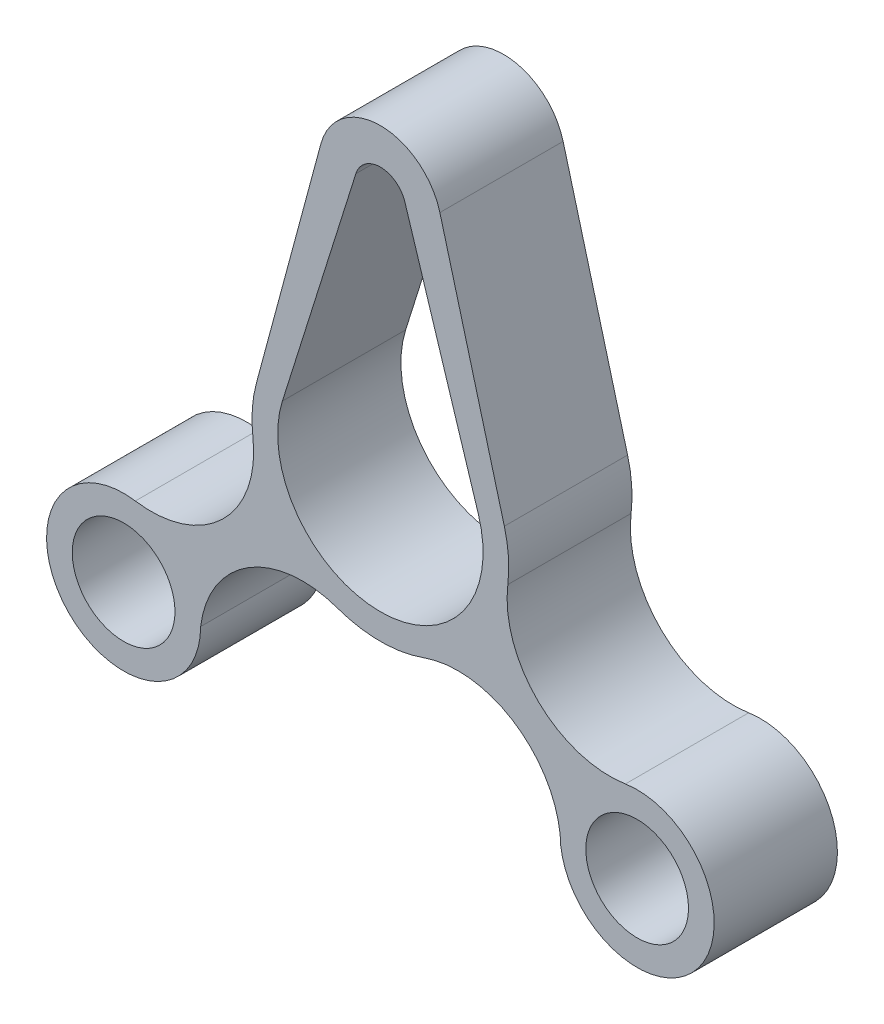
ISO-10303-21;
HEADER;
FILE_DESCRIPTION(('STEP AP214'),'2;1');
FILE_NAME('part.step','',(''),(''),'','','');
FILE_SCHEMA(('AUTOMOTIVE_DESIGN { 1 0 10303 214 1 1 1 1 }'));
ENDSEC;
DATA;
#1=APPLICATION_CONTEXT('core data for automotive mechanical design processes');
#2=APPLICATION_PROTOCOL_DEFINITION('international standard','automotive_design',2000,#1);
#3=PRODUCT_CONTEXT('',#1,'mechanical');
#4=PRODUCT('Part','Part','',(#3));
#5=PRODUCT_RELATED_PRODUCT_CATEGORY('part','',(#4));
#6=PRODUCT_DEFINITION_FORMATION('','',#4);
#7=PRODUCT_DEFINITION_CONTEXT('part definition',#1,'design');
#8=PRODUCT_DEFINITION('design','',#6,#7);
#9=PRODUCT_DEFINITION_SHAPE('','',#8);
#10=(LENGTH_UNIT() NAMED_UNIT(*) SI_UNIT(.MILLI.,.METRE.));
#11=(NAMED_UNIT(*) PLANE_ANGLE_UNIT() SI_UNIT($,.RADIAN.));
#12=(NAMED_UNIT(*) SI_UNIT($,.STERADIAN.) SOLID_ANGLE_UNIT());
#13=UNCERTAINTY_MEASURE_WITH_UNIT(LENGTH_MEASURE(1.E-05),#10,'distance_accuracy_value','');
#14=(GEOMETRIC_REPRESENTATION_CONTEXT(3) GLOBAL_UNCERTAINTY_ASSIGNED_CONTEXT((#13)) GLOBAL_UNIT_ASSIGNED_CONTEXT((#10,
#11,#12)) REPRESENTATION_CONTEXT('',''));
#15=CARTESIAN_POINT('',(0.,0.,0.));
#16=DIRECTION('',(0.,0.,1.));
#17=DIRECTION('',(1.,0.,0.));
#18=AXIS2_PLACEMENT_3D('',#15,#16,#17);
#19=CARTESIAN_POINT('',(15.1416433452855,-42.3760620728752,24.));
#20=DIRECTION('',(0.,0.,-1.));
#21=DIRECTION('',(-1.,0.,0.));
#22=AXIS2_PLACEMENT_3D('',#19,#20,#21);
#23=PLANE('',#22);
#24=CARTESIAN_POINT('',(50.,-40.,24.));
#25=DIRECTION('',(0.,0.,1.));
#26=DIRECTION('',(1.,0.,0.));
#27=AXIS2_PLACEMENT_3D('',#24,#25,#26);
#28=CIRCLE('',#27,10.);
#29=CARTESIAN_POINT('',(60.,-40.,24.));
#30=VERTEX_POINT('',#29);
#31=EDGE_CURVE('E189',#30,#30,#28,.T.);
#32=ORIENTED_EDGE('',*,*,#31,.F.);
#33=EDGE_LOOP('',(#32));
#34=FACE_BOUND('',#33,.T.);
#35=CARTESIAN_POINT('',(15.1416433452855,-42.3760620728752,24.));
#36=DIRECTION('',(0.,0.,-1.));
#37=DIRECTION('',(-1.,0.,0.));
#38=AXIS2_PLACEMENT_3D('',#35,#36,#37);
#39=CIRCLE('',#38,20.);
#40=CARTESIAN_POINT('',(8.41202408071416,-23.5422567071529,24.));
#41=VERTEX_POINT('',#40);
#42=CARTESIAN_POINT('',(35.,-40.,24.));
#43=VERTEX_POINT('',#42);
#44=EDGE_CURVE('E195',#41,#43,#39,.T.);
#45=ORIENTED_EDGE('',*,*,#44,.T.);
#46=CARTESIAN_POINT('',(50.,-40.,24.));
#47=DIRECTION('',(0.,0.,1.));
#48=DIRECTION('',(1.,0.,0.));
#49=AXIS2_PLACEMENT_3D('',#46,#47,#48);
#50=CIRCLE('',#49,15.);
#51=CARTESIAN_POINT('',(47.7173871309142,-25.1746946577858,24.));
#52=VERTEX_POINT('',#51);
#53=EDGE_CURVE('E198',#43,#52,#50,.T.);
#54=ORIENTED_EDGE('',*,*,#53,.T.);
#55=CARTESIAN_POINT('',(44.6739033054664,-5.40762086816695,24.));
#56=DIRECTION('',(0.,0.,-1.));
#57=DIRECTION('',(-1.,0.,0.));
#58=AXIS2_PLACEMENT_3D('',#55,#56,#57);
#59=CIRCLE('',#58,20.);
#60=CARTESIAN_POINT('',(24.8188351697036,-3.00423381564831,24.));
#61=VERTEX_POINT('',#60);
#62=EDGE_CURVE('E201',#52,#61,#59,.T.);
#63=ORIENTED_EDGE('',*,*,#62,.T.);
#64=CARTESIAN_POINT('',(0.,0.,24.));
#65=DIRECTION('',(0.,0.,1.));
#66=DIRECTION('',(1.,0.,0.));
#67=AXIS2_PLACEMENT_3D('',#64,#65,#66);
#68=CIRCLE('',#67,25.);
#69=CARTESIAN_POINT('',(24.1402154091466,6.5,24.));
#70=VERTEX_POINT('',#69);
#71=EDGE_CURVE('E203',#61,#70,#68,.T.);
#72=ORIENTED_EDGE('',*,*,#71,.T.);
#73=DIRECTION('',(-0.26,0.965608616365865,0.));
#74=VECTOR('',#73,1.);
#75=CARTESIAN_POINT('',(24.1402154091466,6.5,24.));
#76=LINE('',#75,#74);
#77=CARTESIAN_POINT('',(11.5873033963904,53.12,24.));
#78=VERTEX_POINT('',#77);
#79=EDGE_CURVE('E205',#70,#78,#76,.T.);
#80=ORIENTED_EDGE('',*,*,#79,.T.);
#81=CARTESIAN_POINT('',(0.,50.,24.));
#82=DIRECTION('',(0.,0.,1.));
#83=DIRECTION('',(1.,0.,0.));
#84=AXIS2_PLACEMENT_3D('',#81,#82,#83);
#85=CIRCLE('',#84,12.);
#86=CARTESIAN_POINT('',(-11.5873033963904,53.12,24.));
#87=VERTEX_POINT('',#86);
#88=EDGE_CURVE('E207',#78,#87,#85,.T.);
#89=ORIENTED_EDGE('',*,*,#88,.T.);
#90=DIRECTION('',(-0.26,-0.965608616365865,0.));
#91=VECTOR('',#90,1.);
#92=CARTESIAN_POINT('',(-24.1402154091466,6.5,24.));
#93=LINE('',#92,#91);
#94=CARTESIAN_POINT('',(-24.1402154091466,6.5,24.));
#95=VERTEX_POINT('',#94);
#96=EDGE_CURVE('E209',#87,#95,#93,.T.);
#97=ORIENTED_EDGE('',*,*,#96,.T.);
#98=CARTESIAN_POINT('',(0.,0.,24.));
#99=DIRECTION('',(0.,0.,1.));
#100=DIRECTION('',(-1.,0.,0.));
#101=AXIS2_PLACEMENT_3D('',#98,#99,#100);
#102=CIRCLE('',#101,25.);
#103=CARTESIAN_POINT('',(-24.8188351697036,-3.00423381564831,24.));
#104=VERTEX_POINT('',#103);
#105=EDGE_CURVE('E211',#95,#104,#102,.T.);
#106=ORIENTED_EDGE('',*,*,#105,.T.);
#107=CARTESIAN_POINT('',(-44.6739033054664,-5.40762086816695,24.));
#108=DIRECTION('',(0.,0.,-1.));
#109=DIRECTION('',(1.,0.,0.));
#110=AXIS2_PLACEMENT_3D('',#107,#108,#109);
#111=CIRCLE('',#110,20.);
#112=CARTESIAN_POINT('',(-47.7173871309142,-25.1746946577858,24.));
#113=VERTEX_POINT('',#112);
#114=EDGE_CURVE('E213',#104,#113,#111,.T.);
#115=ORIENTED_EDGE('',*,*,#114,.T.);
#116=CARTESIAN_POINT('',(-50.,-40.,24.));
#117=DIRECTION('',(0.,0.,1.));
#118=DIRECTION('',(-1.,0.,0.));
#119=AXIS2_PLACEMENT_3D('',#116,#117,#118);
#120=CIRCLE('',#119,15.);
#121=CARTESIAN_POINT('',(-35.,-40.,24.));
#122=VERTEX_POINT('',#121);
#123=EDGE_CURVE('E215',#113,#122,#120,.T.);
#124=ORIENTED_EDGE('',*,*,#123,.T.);
#125=CARTESIAN_POINT('',(-15.1416433452855,-42.3760620728752,24.));
#126=DIRECTION('',(0.,0.,-1.));
#127=DIRECTION('',(1.,0.,0.));
#128=AXIS2_PLACEMENT_3D('',#125,#126,#127);
#129=CIRCLE('',#128,20.);
#130=CARTESIAN_POINT('',(-8.41202408071417,-23.5422567071529,24.));
#131=VERTEX_POINT('',#130);
#132=EDGE_CURVE('E217',#122,#131,#129,.T.);
#133=ORIENTED_EDGE('',*,*,#132,.T.);
#134=CARTESIAN_POINT('',(0.,0.,24.));
#135=DIRECTION('',(0.,0.,1.));
#136=DIRECTION('',(1.,0.,0.));
#137=AXIS2_PLACEMENT_3D('',#134,#135,#136);
#138=CIRCLE('',#137,25.);
#139=EDGE_CURVE('E219',#131,#41,#138,.T.);
#140=ORIENTED_EDGE('',*,*,#139,.T.);
#141=EDGE_LOOP('',(#45,#54,#63,#72,#80,#89,#97,#106,#115,#124,#133,#140));
#142=FACE_BOUND('',#141,.T.);
#143=CARTESIAN_POINT('',(0.,0.,24.));
#144=DIRECTION('',(0.,0.,1.));
#145=DIRECTION('',(1.,0.,0.));
#146=AXIS2_PLACEMENT_3D('',#143,#144,#145);
#147=CIRCLE('',#146,20.);
#148=CARTESIAN_POINT('',(-19.0787840283389,6.,24.));
#149=VERTEX_POINT('',#148);
#150=CARTESIAN_POINT('',(19.0787840283389,6.,24.));
#151=VERTEX_POINT('',#150);
#152=EDGE_CURVE('E150',#149,#151,#147,.T.);
#153=ORIENTED_EDGE('',*,*,#152,.F.);
#154=DIRECTION('',(-0.3,-0.953939201416946,0.));
#155=VECTOR('',#154,1.);
#156=CARTESIAN_POINT('',(-4.76969600708473,51.5,24.));
#157=LINE('',#156,#155);
#158=CARTESIAN_POINT('',(-4.76969600708474,51.5,24.));
#159=VERTEX_POINT('',#158);
#160=EDGE_CURVE('E173',#159,#149,#157,.T.);
#161=ORIENTED_EDGE('',*,*,#160,.F.);
#162=CARTESIAN_POINT('',(0.,50.,24.));
#163=DIRECTION('',(0.,0.,1.));
#164=DIRECTION('',(1.,0.,0.));
#165=AXIS2_PLACEMENT_3D('',#162,#163,#164);
#166=CIRCLE('',#165,5.);
#167=CARTESIAN_POINT('',(4.76969600708473,51.5,24.));
#168=VERTEX_POINT('',#167);
#169=EDGE_CURVE('E171',#168,#159,#166,.T.);
#170=ORIENTED_EDGE('',*,*,#169,.F.);
#171=DIRECTION('',(-0.3,0.953939201416946,0.));
#172=VECTOR('',#171,1.);
#173=CARTESIAN_POINT('',(4.76969600708473,51.5,24.));
#174=LINE('',#173,#172);
#175=EDGE_CURVE('E158',#151,#168,#174,.T.);
#176=ORIENTED_EDGE('',*,*,#175,.F.);
#177=EDGE_LOOP('',(#153,#161,#170,#176));
#178=FACE_BOUND('',#177,.T.);
#179=CARTESIAN_POINT('',(-50.,-40.,24.));
#180=DIRECTION('',(0.,0.,1.));
#181=DIRECTION('',(-1.,0.,0.));
#182=AXIS2_PLACEMENT_3D('',#179,#180,#181);
#183=CIRCLE('',#182,10.);
#184=CARTESIAN_POINT('',(-60.,-40.,24.));
#185=VERTEX_POINT('',#184);
#186=EDGE_CURVE('E179',#185,#185,#183,.T.);
#187=ORIENTED_EDGE('',*,*,#186,.F.);
#188=EDGE_LOOP('',(#187));
#189=FACE_BOUND('',#188,.T.);
#190=ADVANCED_FACE('F37',(#34,#142,#178,#189),#23,.F.);
#191=CARTESIAN_POINT('',(15.1416433452855,-42.3760620728752,0.));
#192=DIRECTION('',(0.,0.,-1.));
#193=DIRECTION('',(-1.,0.,0.));
#194=AXIS2_PLACEMENT_3D('',#191,#192,#193);
#195=PLANE('',#194);
#196=DIRECTION('',(-0.3,-0.953939201416946,0.));
#197=VECTOR('',#196,1.);
#198=CARTESIAN_POINT('',(-4.76969600708473,51.5,0.));
#199=LINE('',#198,#197);
#200=CARTESIAN_POINT('',(-4.76969600708473,51.5,0.));
#201=VERTEX_POINT('',#200);
#202=CARTESIAN_POINT('',(-19.0787840283389,6.,0.));
#203=VERTEX_POINT('',#202);
#204=EDGE_CURVE('E159',#201,#203,#199,.T.);
#205=ORIENTED_EDGE('',*,*,#204,.T.);
#206=CARTESIAN_POINT('',(0.,0.,0.));
#207=DIRECTION('',(0.,0.,1.));
#208=DIRECTION('',(1.,0.,0.));
#209=AXIS2_PLACEMENT_3D('',#206,#207,#208);
#210=CIRCLE('',#209,20.);
#211=CARTESIAN_POINT('',(19.0787840283389,6.,0.));
#212=VERTEX_POINT('',#211);
#213=EDGE_CURVE('E60',#203,#212,#210,.T.);
#214=ORIENTED_EDGE('',*,*,#213,.T.);
#215=DIRECTION('',(-0.3,0.953939201416946,0.));
#216=VECTOR('',#215,1.);
#217=CARTESIAN_POINT('',(4.76969600708473,51.5,0.));
#218=LINE('',#217,#216);
#219=CARTESIAN_POINT('',(4.76969600708473,51.5,0.));
#220=VERTEX_POINT('',#219);
#221=EDGE_CURVE('E165',#212,#220,#218,.T.);
#222=ORIENTED_EDGE('',*,*,#221,.T.);
#223=CARTESIAN_POINT('',(0.,50.,0.));
#224=DIRECTION('',(0.,0.,1.));
#225=DIRECTION('',(1.,0.,0.));
#226=AXIS2_PLACEMENT_3D('',#223,#224,#225);
#227=CIRCLE('',#226,5.);
#228=EDGE_CURVE('E181',#220,#201,#227,.T.);
#229=ORIENTED_EDGE('',*,*,#228,.T.);
#230=EDGE_LOOP('',(#205,#214,#222,#229));
#231=FACE_BOUND('',#230,.T.);
#232=CARTESIAN_POINT('',(50.,-40.,0.));
#233=DIRECTION('',(0.,0.,1.));
#234=DIRECTION('',(1.,0.,0.));
#235=AXIS2_PLACEMENT_3D('',#232,#233,#234);
#236=CIRCLE('',#235,10.);
#237=CARTESIAN_POINT('',(60.,-40.,0.));
#238=VERTEX_POINT('',#237);
#239=EDGE_CURVE('E166',#238,#238,#236,.T.);
#240=ORIENTED_EDGE('',*,*,#239,.T.);
#241=EDGE_LOOP('',(#240));
#242=FACE_BOUND('',#241,.T.);
#243=CARTESIAN_POINT('',(15.1416433452855,-42.3760620728752,0.));
#244=DIRECTION('',(0.,0.,-1.));
#245=DIRECTION('',(-1.,0.,0.));
#246=AXIS2_PLACEMENT_3D('',#243,#244,#245);
#247=CIRCLE('',#246,20.);
#248=CARTESIAN_POINT('',(8.41202408071416,-23.5422567071529,0.));
#249=VERTEX_POINT('',#248);
#250=CARTESIAN_POINT('',(35.,-40.,0.));
#251=VERTEX_POINT('',#250);
#252=EDGE_CURVE('E192',#249,#251,#247,.T.);
#253=ORIENTED_EDGE('',*,*,#252,.F.);
#254=CARTESIAN_POINT('',(0.,0.,0.));
#255=DIRECTION('',(0.,0.,1.));
#256=DIRECTION('',(1.,0.,0.));
#257=AXIS2_PLACEMENT_3D('',#254,#255,#256);
#258=CIRCLE('',#257,25.);
#259=CARTESIAN_POINT('',(-8.41202408071417,-23.5422567071529,0.));
#260=VERTEX_POINT('',#259);
#261=EDGE_CURVE('E199',#260,#249,#258,.T.);
#262=ORIENTED_EDGE('',*,*,#261,.F.);
#263=CARTESIAN_POINT('',(-15.1416433452855,-42.3760620728752,0.));
#264=DIRECTION('',(0.,0.,-1.));
#265=DIRECTION('',(1.,0.,0.));
#266=AXIS2_PLACEMENT_3D('',#263,#264,#265);
#267=CIRCLE('',#266,20.);
#268=CARTESIAN_POINT('',(-35.,-40.,0.));
#269=VERTEX_POINT('',#268);
#270=EDGE_CURVE('E242',#269,#260,#267,.T.);
#271=ORIENTED_EDGE('',*,*,#270,.F.);
#272=CARTESIAN_POINT('',(-50.,-40.,0.));
#273=DIRECTION('',(0.,0.,1.));
#274=DIRECTION('',(-1.,0.,0.));
#275=AXIS2_PLACEMENT_3D('',#272,#273,#274);
#276=CIRCLE('',#275,15.);
#277=CARTESIAN_POINT('',(-47.7173871309142,-25.1746946577858,0.));
#278=VERTEX_POINT('',#277);
#279=EDGE_CURVE('E240',#278,#269,#276,.T.);
#280=ORIENTED_EDGE('',*,*,#279,.F.);
#281=CARTESIAN_POINT('',(-44.6739033054664,-5.40762086816695,0.));
#282=DIRECTION('',(0.,0.,-1.));
#283=DIRECTION('',(1.,0.,0.));
#284=AXIS2_PLACEMENT_3D('',#281,#282,#283);
#285=CIRCLE('',#284,20.);
#286=CARTESIAN_POINT('',(-24.8188351697036,-3.00423381564831,0.));
#287=VERTEX_POINT('',#286);
#288=EDGE_CURVE('E238',#287,#278,#285,.T.);
#289=ORIENTED_EDGE('',*,*,#288,.F.);
#290=CARTESIAN_POINT('',(0.,0.,0.));
#291=DIRECTION('',(0.,0.,1.));
#292=DIRECTION('',(-1.,0.,0.));
#293=AXIS2_PLACEMENT_3D('',#290,#291,#292);
#294=CIRCLE('',#293,25.);
#295=CARTESIAN_POINT('',(-24.1402154091466,6.5,0.));
#296=VERTEX_POINT('',#295);
#297=EDGE_CURVE('E236',#296,#287,#294,.T.);
#298=ORIENTED_EDGE('',*,*,#297,.F.);
#299=DIRECTION('',(-0.26,-0.965608616365865,0.));
#300=VECTOR('',#299,1.);
#301=CARTESIAN_POINT('',(-24.1402154091466,6.5,0.));
#302=LINE('',#301,#300);
#303=CARTESIAN_POINT('',(-11.5873033963904,53.12,0.));
#304=VERTEX_POINT('',#303);
#305=EDGE_CURVE('E234',#304,#296,#302,.T.);
#306=ORIENTED_EDGE('',*,*,#305,.F.);
#307=CARTESIAN_POINT('',(0.,50.,0.));
#308=DIRECTION('',(0.,0.,1.));
#309=DIRECTION('',(1.,0.,0.));
#310=AXIS2_PLACEMENT_3D('',#307,#308,#309);
#311=CIRCLE('',#310,12.);
#312=CARTESIAN_POINT('',(11.5873033963904,53.12,0.));
#313=VERTEX_POINT('',#312);
#314=EDGE_CURVE('E232',#313,#304,#311,.T.);
#315=ORIENTED_EDGE('',*,*,#314,.F.);
#316=DIRECTION('',(-0.26,0.965608616365865,0.));
#317=VECTOR('',#316,1.);
#318=CARTESIAN_POINT('',(24.1402154091466,6.5,0.));
#319=LINE('',#318,#317);
#320=CARTESIAN_POINT('',(24.1402154091466,6.5,0.));
#321=VERTEX_POINT('',#320);
#322=EDGE_CURVE('E230',#321,#313,#319,.T.);
#323=ORIENTED_EDGE('',*,*,#322,.F.);
#324=CARTESIAN_POINT('',(0.,0.,0.));
#325=DIRECTION('',(0.,0.,1.));
#326=DIRECTION('',(1.,0.,0.));
#327=AXIS2_PLACEMENT_3D('',#324,#325,#326);
#328=CIRCLE('',#327,25.);
#329=CARTESIAN_POINT('',(24.8188351697036,-3.00423381564831,0.));
#330=VERTEX_POINT('',#329);
#331=EDGE_CURVE('E228',#330,#321,#328,.T.);
#332=ORIENTED_EDGE('',*,*,#331,.F.);
#333=CARTESIAN_POINT('',(44.6739033054664,-5.40762086816695,0.));
#334=DIRECTION('',(0.,0.,-1.));
#335=DIRECTION('',(-1.,0.,0.));
#336=AXIS2_PLACEMENT_3D('',#333,#334,#335);
#337=CIRCLE('',#336,20.);
#338=CARTESIAN_POINT('',(47.7173871309142,-25.1746946577858,0.));
#339=VERTEX_POINT('',#338);
#340=EDGE_CURVE('E226',#339,#330,#337,.T.);
#341=ORIENTED_EDGE('',*,*,#340,.F.);
#342=CARTESIAN_POINT('',(50.,-40.,0.));
#343=DIRECTION('',(0.,0.,1.));
#344=DIRECTION('',(1.,0.,0.));
#345=AXIS2_PLACEMENT_3D('',#342,#343,#344);
#346=CIRCLE('',#345,15.);
#347=EDGE_CURVE('E224',#251,#339,#346,.T.);
#348=ORIENTED_EDGE('',*,*,#347,.F.);
#349=EDGE_LOOP('',(#253,#262,#271,#280,#289,#298,#306,#315,#323,#332,#341,#348));
#350=FACE_BOUND('',#349,.T.);
#351=CARTESIAN_POINT('',(-50.,-40.,0.));
#352=DIRECTION('',(0.,0.,1.));
#353=DIRECTION('',(-1.,0.,0.));
#354=AXIS2_PLACEMENT_3D('',#351,#352,#353);
#355=CIRCLE('',#354,10.);
#356=CARTESIAN_POINT('',(-60.,-40.,0.));
#357=VERTEX_POINT('',#356);
#358=EDGE_CURVE('E508',#357,#357,#355,.T.);
#359=ORIENTED_EDGE('',*,*,#358,.T.);
#360=EDGE_LOOP('',(#359));
#361=FACE_BOUND('',#360,.T.);
#362=ADVANCED_FACE('F284',(#231,#242,#350,#361),#195,.T.);
#363=CARTESIAN_POINT('',(15.1416433452855,-42.3760620728752,24.));
#364=DIRECTION('',(0.,0.,-1.));
#365=DIRECTION('',(-1.,0.,0.));
#366=AXIS2_PLACEMENT_3D('',#363,#364,#365);
#367=CYLINDRICAL_SURFACE('',#366,20.);
#368=ORIENTED_EDGE('',*,*,#252,.T.);
#369=DIRECTION('',(0.,0.,-1.));
#370=VECTOR('',#369,1.);
#371=CARTESIAN_POINT('',(35.,-40.,24.));
#372=LINE('',#371,#370);
#373=EDGE_CURVE('E11',#43,#251,#372,.T.);
#374=ORIENTED_EDGE('',*,*,#373,.F.);
#375=ORIENTED_EDGE('',*,*,#44,.F.);
#376=DIRECTION('',(0.,0.,-1.));
#377=VECTOR('',#376,1.);
#378=CARTESIAN_POINT('',(8.41202408071416,-23.5422567071529,24.));
#379=LINE('',#378,#377);
#380=EDGE_CURVE('E221',#41,#249,#379,.T.);
#381=ORIENTED_EDGE('',*,*,#380,.T.);
#382=EDGE_LOOP('',(#368,#374,#375,#381));
#383=FACE_BOUND('',#382,.T.);
#384=ADVANCED_FACE('F39',(#383),#367,.F.);
#385=CARTESIAN_POINT('',(50.,-40.,24.));
#386=DIRECTION('',(0.,0.,-1.));
#387=DIRECTION('',(-1.,0.,0.));
#388=AXIS2_PLACEMENT_3D('',#385,#386,#387);
#389=CYLINDRICAL_SURFACE('',#388,15.);
#390=ORIENTED_EDGE('',*,*,#347,.T.);
#391=DIRECTION('',(0.,0.,-1.));
#392=VECTOR('',#391,1.);
#393=CARTESIAN_POINT('',(47.7173871309142,-25.1746946577858,24.));
#394=LINE('',#393,#392);
#395=EDGE_CURVE('E45',#52,#339,#394,.T.);
#396=ORIENTED_EDGE('',*,*,#395,.F.);
#397=ORIENTED_EDGE('',*,*,#53,.F.);
#398=ORIENTED_EDGE('',*,*,#373,.T.);
#399=EDGE_LOOP('',(#390,#396,#397,#398));
#400=FACE_BOUND('',#399,.T.);
#401=ADVANCED_FACE('F301',(#400),#389,.T.);
#402=CARTESIAN_POINT('',(44.6739033054664,-5.40762086816695,24.));
#403=DIRECTION('',(0.,0.,-1.));
#404=DIRECTION('',(-1.,0.,0.));
#405=AXIS2_PLACEMENT_3D('',#402,#403,#404);
#406=CYLINDRICAL_SURFACE('',#405,20.);
#407=ORIENTED_EDGE('',*,*,#340,.T.);
#408=DIRECTION('',(0.,0.,-1.));
#409=VECTOR('',#408,1.);
#410=CARTESIAN_POINT('',(24.8188351697036,-3.00423381564831,24.));
#411=LINE('',#410,#409);
#412=EDGE_CURVE('E271',#61,#330,#411,.T.);
#413=ORIENTED_EDGE('',*,*,#412,.F.);
#414=ORIENTED_EDGE('',*,*,#62,.F.);
#415=ORIENTED_EDGE('',*,*,#395,.T.);
#416=EDGE_LOOP('',(#407,#413,#414,#415));
#417=FACE_BOUND('',#416,.T.);
#418=ADVANCED_FACE('F278',(#417),#406,.F.);
#419=CARTESIAN_POINT('',(0.,0.,24.));
#420=DIRECTION('',(0.,0.,-1.));
#421=DIRECTION('',(-1.,0.,0.));
#422=AXIS2_PLACEMENT_3D('',#419,#420,#421);
#423=CYLINDRICAL_SURFACE('',#422,25.);
#424=ORIENTED_EDGE('',*,*,#331,.T.);
#425=DIRECTION('',(0.,0.,-1.));
#426=VECTOR('',#425,1.);
#427=CARTESIAN_POINT('',(24.1402154091466,6.5,24.));
#428=LINE('',#427,#426);
#429=EDGE_CURVE('E268',#70,#321,#428,.T.);
#430=ORIENTED_EDGE('',*,*,#429,.F.);
#431=ORIENTED_EDGE('',*,*,#71,.F.);
#432=ORIENTED_EDGE('',*,*,#412,.T.);
#433=EDGE_LOOP('',(#424,#430,#431,#432));
#434=FACE_BOUND('',#433,.T.);
#435=ADVANCED_FACE('F290',(#434),#423,.T.);
#436=CARTESIAN_POINT('',(24.1402154091466,6.5,24.));
#437=DIRECTION('',(-0.965608616365865,-0.26,0.));
#438=DIRECTION('',(0.26,-0.965608616365865,0.));
#439=AXIS2_PLACEMENT_3D('',#436,#437,#438);
#440=PLANE('',#439);
#441=ORIENTED_EDGE('',*,*,#322,.T.);
#442=DIRECTION('',(0.,0.,-1.));
#443=VECTOR('',#442,1.);
#444=CARTESIAN_POINT('',(11.5873033963904,53.12,24.));
#445=LINE('',#444,#443);
#446=EDGE_CURVE('E265',#78,#313,#445,.T.);
#447=ORIENTED_EDGE('',*,*,#446,.F.);
#448=ORIENTED_EDGE('',*,*,#79,.F.);
#449=ORIENTED_EDGE('',*,*,#429,.T.);
#450=EDGE_LOOP('',(#441,#447,#448,#449));
#451=FACE_BOUND('',#450,.T.);
#452=ADVANCED_FACE('F294',(#451),#440,.F.);
#453=CARTESIAN_POINT('',(0.,50.,24.));
#454=DIRECTION('',(0.,0.,-1.));
#455=DIRECTION('',(-1.,0.,0.));
#456=AXIS2_PLACEMENT_3D('',#453,#454,#455);
#457=CYLINDRICAL_SURFACE('',#456,12.);
#458=ORIENTED_EDGE('',*,*,#314,.T.);
#459=DIRECTION('',(0.,0.,-1.));
#460=VECTOR('',#459,1.);
#461=CARTESIAN_POINT('',(-11.5873033963904,53.12,24.));
#462=LINE('',#461,#460);
#463=EDGE_CURVE('E262',#87,#304,#462,.T.);
#464=ORIENTED_EDGE('',*,*,#463,.F.);
#465=ORIENTED_EDGE('',*,*,#88,.F.);
#466=ORIENTED_EDGE('',*,*,#446,.T.);
#467=EDGE_LOOP('',(#458,#464,#465,#466));
#468=FACE_BOUND('',#467,.T.);
#469=ADVANCED_FACE('F334',(#468),#457,.T.);
#470=CARTESIAN_POINT('',(-24.1402154091466,6.5,24.));
#471=DIRECTION('',(0.965608616365865,-0.26,0.));
#472=DIRECTION('',(0.26,0.965608616365865,0.));
#473=AXIS2_PLACEMENT_3D('',#470,#471,#472);
#474=PLANE('',#473);
#475=ORIENTED_EDGE('',*,*,#305,.T.);
#476=DIRECTION('',(0.,0.,-1.));
#477=VECTOR('',#476,1.);
#478=CARTESIAN_POINT('',(-24.1402154091466,6.5,24.));
#479=LINE('',#478,#477);
#480=EDGE_CURVE('E259',#95,#296,#479,.T.);
#481=ORIENTED_EDGE('',*,*,#480,.F.);
#482=ORIENTED_EDGE('',*,*,#96,.F.);
#483=ORIENTED_EDGE('',*,*,#463,.T.);
#484=EDGE_LOOP('',(#475,#481,#482,#483));
#485=FACE_BOUND('',#484,.T.);
#486=ADVANCED_FACE('F332',(#485),#474,.F.);
#487=CARTESIAN_POINT('',(0.,0.,24.));
#488=DIRECTION('',(0.,0.,-1.));
#489=DIRECTION('',(-1.,0.,0.));
#490=AXIS2_PLACEMENT_3D('',#487,#488,#489);
#491=CYLINDRICAL_SURFACE('',#490,25.);
#492=ORIENTED_EDGE('',*,*,#297,.T.);
#493=DIRECTION('',(0.,0.,-1.));
#494=VECTOR('',#493,1.);
#495=CARTESIAN_POINT('',(-24.8188351697036,-3.00423381564831,24.));
#496=LINE('',#495,#494);
#497=EDGE_CURVE('E256',#104,#287,#496,.T.);
#498=ORIENTED_EDGE('',*,*,#497,.F.);
#499=ORIENTED_EDGE('',*,*,#105,.F.);
#500=ORIENTED_EDGE('',*,*,#480,.T.);
#501=EDGE_LOOP('',(#492,#498,#499,#500));
#502=FACE_BOUND('',#501,.T.);
#503=ADVANCED_FACE('F328',(#502),#491,.T.);
#504=CARTESIAN_POINT('',(-44.6739033054664,-5.40762086816695,24.));
#505=DIRECTION('',(0.,0.,-1.));
#506=DIRECTION('',(-1.,0.,0.));
#507=AXIS2_PLACEMENT_3D('',#504,#505,#506);
#508=CYLINDRICAL_SURFACE('',#507,20.);
#509=ORIENTED_EDGE('',*,*,#288,.T.);
#510=DIRECTION('',(0.,0.,-1.));
#511=VECTOR('',#510,1.);
#512=CARTESIAN_POINT('',(-47.7173871309142,-25.1746946577858,24.));
#513=LINE('',#512,#511);
#514=EDGE_CURVE('E253',#113,#278,#513,.T.);
#515=ORIENTED_EDGE('',*,*,#514,.F.);
#516=ORIENTED_EDGE('',*,*,#114,.F.);
#517=ORIENTED_EDGE('',*,*,#497,.T.);
#518=EDGE_LOOP('',(#509,#515,#516,#517));
#519=FACE_BOUND('',#518,.T.);
#520=ADVANCED_FACE('F323',(#519),#508,.F.);
#521=CARTESIAN_POINT('',(-50.,-40.,24.));
#522=DIRECTION('',(0.,0.,-1.));
#523=DIRECTION('',(-1.,0.,0.));
#524=AXIS2_PLACEMENT_3D('',#521,#522,#523);
#525=CYLINDRICAL_SURFACE('',#524,15.);
#526=ORIENTED_EDGE('',*,*,#279,.T.);
#527=DIRECTION('',(0.,0.,-1.));
#528=VECTOR('',#527,1.);
#529=CARTESIAN_POINT('',(-35.,-40.,24.));
#530=LINE('',#529,#528);
#531=EDGE_CURVE('E250',#122,#269,#530,.T.);
#532=ORIENTED_EDGE('',*,*,#531,.F.);
#533=ORIENTED_EDGE('',*,*,#123,.F.);
#534=ORIENTED_EDGE('',*,*,#514,.T.);
#535=EDGE_LOOP('',(#526,#532,#533,#534));
#536=FACE_BOUND('',#535,.T.);
#537=ADVANCED_FACE('F317',(#536),#525,.T.);
#538=CARTESIAN_POINT('',(-15.1416433452855,-42.3760620728752,24.));
#539=DIRECTION('',(0.,0.,-1.));
#540=DIRECTION('',(-1.,0.,0.));
#541=AXIS2_PLACEMENT_3D('',#538,#539,#540);
#542=CYLINDRICAL_SURFACE('',#541,20.);
#543=ORIENTED_EDGE('',*,*,#270,.T.);
#544=DIRECTION('',(0.,0.,-1.));
#545=VECTOR('',#544,1.);
#546=CARTESIAN_POINT('',(-8.41202408071417,-23.5422567071529,24.));
#547=LINE('',#546,#545);
#548=EDGE_CURVE('E247',#131,#260,#547,.T.);
#549=ORIENTED_EDGE('',*,*,#548,.F.);
#550=ORIENTED_EDGE('',*,*,#132,.F.);
#551=ORIENTED_EDGE('',*,*,#531,.T.);
#552=EDGE_LOOP('',(#543,#549,#550,#551));
#553=FACE_BOUND('',#552,.T.);
#554=ADVANCED_FACE('F313',(#553),#542,.F.);
#555=CARTESIAN_POINT('',(0.,0.,24.));
#556=DIRECTION('',(0.,0.,-1.));
#557=DIRECTION('',(-1.,0.,0.));
#558=AXIS2_PLACEMENT_3D('',#555,#556,#557);
#559=CYLINDRICAL_SURFACE('',#558,25.);
#560=ORIENTED_EDGE('',*,*,#261,.T.);
#561=ORIENTED_EDGE('',*,*,#380,.F.);
#562=ORIENTED_EDGE('',*,*,#139,.F.);
#563=ORIENTED_EDGE('',*,*,#548,.T.);
#564=EDGE_LOOP('',(#560,#561,#562,#563));
#565=FACE_BOUND('',#564,.T.);
#566=ADVANCED_FACE('F308',(#565),#559,.T.);
#567=CARTESIAN_POINT('',(50.,-40.,24.));
#568=DIRECTION('',(0.,0.,-1.));
#569=DIRECTION('',(-1.,0.,0.));
#570=AXIS2_PLACEMENT_3D('',#567,#568,#569);
#571=CYLINDRICAL_SURFACE('',#570,10.);
#572=ORIENTED_EDGE('',*,*,#31,.T.);
#573=EDGE_LOOP('',(#572));
#574=FACE_BOUND('',#573,.T.);
#575=ORIENTED_EDGE('',*,*,#239,.F.);
#576=EDGE_LOOP('',(#575));
#577=FACE_BOUND('',#576,.T.);
#578=ADVANCED_FACE('F353',(#574,#577),#571,.F.);
#579=CARTESIAN_POINT('',(0.,0.,24.));
#580=DIRECTION('',(0.,0.,-1.));
#581=DIRECTION('',(-1.,0.,0.));
#582=AXIS2_PLACEMENT_3D('',#579,#580,#581);
#583=CYLINDRICAL_SURFACE('',#582,20.);
#584=ORIENTED_EDGE('',*,*,#213,.F.);
#585=DIRECTION('',(0.,0.,-1.));
#586=VECTOR('',#585,1.);
#587=CARTESIAN_POINT('',(-19.0787840283389,6.,24.));
#588=LINE('',#587,#586);
#589=EDGE_CURVE('E154',#149,#203,#588,.T.);
#590=ORIENTED_EDGE('',*,*,#589,.F.);
#591=ORIENTED_EDGE('',*,*,#152,.T.);
#592=DIRECTION('',(0.,0.,-1.));
#593=VECTOR('',#592,1.);
#594=CARTESIAN_POINT('',(19.0787840283389,6.,24.));
#595=LINE('',#594,#593);
#596=EDGE_CURVE('E153',#151,#212,#595,.T.);
#597=ORIENTED_EDGE('',*,*,#596,.T.);
#598=EDGE_LOOP('',(#584,#590,#591,#597));
#599=FACE_BOUND('',#598,.T.);
#600=ADVANCED_FACE('F152',(#599),#583,.F.);
#601=CARTESIAN_POINT('',(4.76969600708473,51.5,24.));
#602=DIRECTION('',(-0.953939201416946,-0.3,0.));
#603=DIRECTION('',(0.3,-0.953939201416946,0.));
#604=AXIS2_PLACEMENT_3D('',#601,#602,#603);
#605=PLANE('',#604);
#606=ORIENTED_EDGE('',*,*,#221,.F.);
#607=ORIENTED_EDGE('',*,*,#596,.F.);
#608=ORIENTED_EDGE('',*,*,#175,.T.);
#609=DIRECTION('',(0.,0.,-1.));
#610=VECTOR('',#609,1.);
#611=CARTESIAN_POINT('',(4.76969600708473,51.5,24.));
#612=LINE('',#611,#610);
#613=EDGE_CURVE('E167',#168,#220,#612,.T.);
#614=ORIENTED_EDGE('',*,*,#613,.T.);
#615=EDGE_LOOP('',(#606,#607,#608,#614));
#616=FACE_BOUND('',#615,.T.);
#617=ADVANCED_FACE('F162',(#616),#605,.T.);
#618=CARTESIAN_POINT('',(0.,50.,24.));
#619=DIRECTION('',(0.,0.,-1.));
#620=DIRECTION('',(-1.,0.,0.));
#621=AXIS2_PLACEMENT_3D('',#618,#619,#620);
#622=CYLINDRICAL_SURFACE('',#621,5.);
#623=ORIENTED_EDGE('',*,*,#228,.F.);
#624=ORIENTED_EDGE('',*,*,#613,.F.);
#625=ORIENTED_EDGE('',*,*,#169,.T.);
#626=DIRECTION('',(0.,0.,-1.));
#627=VECTOR('',#626,1.);
#628=CARTESIAN_POINT('',(-4.76969600708473,51.5,24.));
#629=LINE('',#628,#627);
#630=EDGE_CURVE('E52',#159,#201,#629,.T.);
#631=ORIENTED_EDGE('',*,*,#630,.T.);
#632=EDGE_LOOP('',(#623,#624,#625,#631));
#633=FACE_BOUND('',#632,.T.);
#634=ADVANCED_FACE('F402',(#633),#622,.F.);
#635=CARTESIAN_POINT('',(-4.76969600708473,51.5,24.));
#636=DIRECTION('',(0.953939201416946,-0.3,0.));
#637=DIRECTION('',(0.3,0.953939201416946,0.));
#638=AXIS2_PLACEMENT_3D('',#635,#636,#637);
#639=PLANE('',#638);
#640=ORIENTED_EDGE('',*,*,#204,.F.);
#641=ORIENTED_EDGE('',*,*,#630,.F.);
#642=ORIENTED_EDGE('',*,*,#160,.T.);
#643=ORIENTED_EDGE('',*,*,#589,.T.);
#644=EDGE_LOOP('',(#640,#641,#642,#643));
#645=FACE_BOUND('',#644,.T.);
#646=ADVANCED_FACE('F409',(#645),#639,.T.);
#647=CARTESIAN_POINT('',(-50.,-40.,24.));
#648=DIRECTION('',(0.,0.,-1.));
#649=DIRECTION('',(-1.,0.,0.));
#650=AXIS2_PLACEMENT_3D('',#647,#648,#649);
#651=CYLINDRICAL_SURFACE('',#650,10.);
#652=ORIENTED_EDGE('',*,*,#186,.T.);
#653=EDGE_LOOP('',(#652));
#654=FACE_BOUND('',#653,.T.);
#655=ORIENTED_EDGE('',*,*,#358,.F.);
#656=EDGE_LOOP('',(#655));
#657=FACE_BOUND('',#656,.T.);
#658=ADVANCED_FACE('F417',(#654,#657),#651,.F.);
#659=CLOSED_SHELL('',(#190,#362,#384,#401,#418,#435,#452,#469,#486,#503,#520,#537,#554,#566,
#578,#600,#617,#634,#646,#658));
#660=MANIFOLD_SOLID_BREP('B2',#659);
#661=ADVANCED_BREP_SHAPE_REPRESENTATION('',(#18,#660),#14);
#662=SHAPE_DEFINITION_REPRESENTATION(#9,#661);
ENDSEC;
END-ISO-10303-21;
